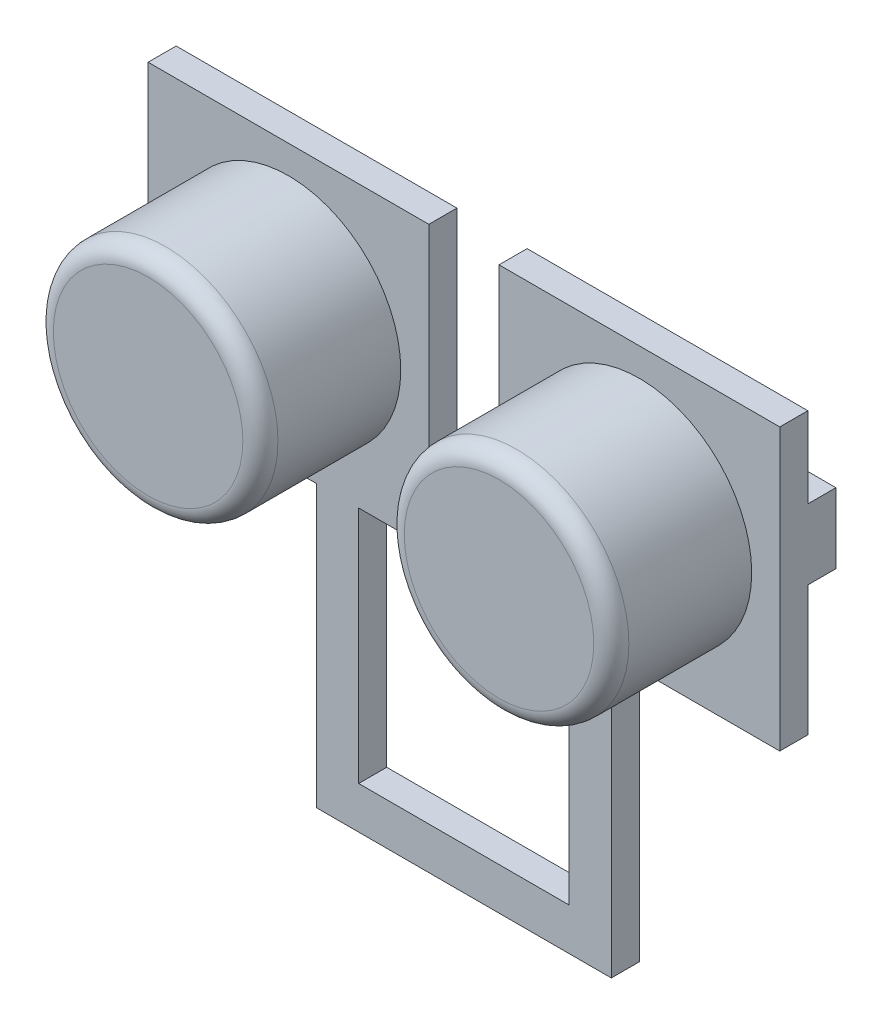
ISO-10303-21;
HEADER;
FILE_DESCRIPTION(('STEP AP214'),'2;1');
FILE_NAME('part.step','',(''),(''),'','','');
FILE_SCHEMA(('AUTOMOTIVE_DESIGN { 1 0 10303 214 1 1 1 1 }'));
ENDSEC;
DATA;
#1=APPLICATION_CONTEXT('core data for automotive mechanical design processes');
#2=APPLICATION_PROTOCOL_DEFINITION('international standard','automotive_design',2000,#1);
#3=PRODUCT_CONTEXT('',#1,'mechanical');
#4=PRODUCT('Part','Part','',(#3));
#5=PRODUCT_RELATED_PRODUCT_CATEGORY('part','',(#4));
#6=PRODUCT_DEFINITION_FORMATION('','',#4);
#7=PRODUCT_DEFINITION_CONTEXT('part definition',#1,'design');
#8=PRODUCT_DEFINITION('design','',#6,#7);
#9=PRODUCT_DEFINITION_SHAPE('','',#8);
#10=(LENGTH_UNIT() NAMED_UNIT(*) SI_UNIT(.MILLI.,.METRE.));
#11=(NAMED_UNIT(*) PLANE_ANGLE_UNIT() SI_UNIT($,.RADIAN.));
#12=(NAMED_UNIT(*) SI_UNIT($,.STERADIAN.) SOLID_ANGLE_UNIT());
#13=UNCERTAINTY_MEASURE_WITH_UNIT(LENGTH_MEASURE(1.E-05),#10,'distance_accuracy_value','');
#14=(GEOMETRIC_REPRESENTATION_CONTEXT(3) GLOBAL_UNCERTAINTY_ASSIGNED_CONTEXT((#13)) GLOBAL_UNIT_ASSIGNED_CONTEXT((#10,
#11,#12)) REPRESENTATION_CONTEXT('',''));
#15=CARTESIAN_POINT('',(0.,0.,0.));
#16=DIRECTION('',(0.,0.,1.));
#17=DIRECTION('',(1.,0.,0.));
#18=AXIS2_PLACEMENT_3D('',#15,#16,#17);
#19=CARTESIAN_POINT('',(-0.999999999999985,-4.00000000000001,-0.8));
#20=DIRECTION('',(0.,1.,0.));
#21=DIRECTION('',(0.,0.,1.));
#22=AXIS2_PLACEMENT_3D('',#19,#20,#21);
#23=PLANE('',#22);
#24=DIRECTION('',(0.,0.,-1.));
#25=VECTOR('',#24,1.);
#26=CARTESIAN_POINT('',(-4.19999999999999,-3.99999999999999,0.));
#27=LINE('',#26,#25);
#28=CARTESIAN_POINT('',(-4.19999999999999,-3.99999999999999,0.));
#29=VERTEX_POINT('',#28);
#30=CARTESIAN_POINT('',(-4.19999999999999,-4.00000000000001,-0.8));
#31=VERTEX_POINT('',#30);
#32=EDGE_CURVE('E309',#29,#31,#27,.T.);
#33=ORIENTED_EDGE('',*,*,#32,.F.);
#34=DIRECTION('',(-1.,0.,0.));
#35=VECTOR('',#34,1.);
#36=CARTESIAN_POINT('',(-0.999999999999985,-4.00000000000001,0.));
#37=LINE('',#36,#35);
#38=CARTESIAN_POINT('',(-9.,-4.00000000000001,0.));
#39=VERTEX_POINT('',#38);
#40=EDGE_CURVE('E365',#29,#39,#37,.T.);
#41=ORIENTED_EDGE('',*,*,#40,.T.);
#42=DIRECTION('',(0.,0.,1.));
#43=VECTOR('',#42,1.);
#44=CARTESIAN_POINT('',(-9.,-4.00000000000001,-0.8));
#45=LINE('',#44,#43);
#46=CARTESIAN_POINT('',(-9.,-4.00000000000001,-0.8));
#47=VERTEX_POINT('',#46);
#48=EDGE_CURVE('E350',#47,#39,#45,.T.);
#49=ORIENTED_EDGE('',*,*,#48,.F.);
#50=DIRECTION('',(-1.,0.,0.));
#51=VECTOR('',#50,1.);
#52=CARTESIAN_POINT('',(-0.999999999999985,-4.00000000000001,-0.8));
#53=LINE('',#52,#51);
#54=EDGE_CURVE('E53',#31,#47,#53,.T.);
#55=ORIENTED_EDGE('',*,*,#54,.F.);
#56=EDGE_LOOP('',(#33,#41,#49,#55));
#57=FACE_BOUND('',#56,.T.);
#58=ADVANCED_FACE('F38',(#57),#23,.F.);
#59=CARTESIAN_POINT('',(-4.99999999999999,0.,4.));
#60=DIRECTION('',(0.,0.,-1.));
#61=DIRECTION('',(-1.,0.,0.));
#62=AXIS2_PLACEMENT_3D('',#59,#60,#61);
#63=CYLINDRICAL_SURFACE('',#62,3.20000000000001);
#64=CARTESIAN_POINT('',(-4.99999999999999,0.,3.5));
#65=DIRECTION('',(0.,0.,1.));
#66=DIRECTION('',(1.,0.,0.));
#67=AXIS2_PLACEMENT_3D('',#64,#65,#66);
#68=CIRCLE('',#67,3.20000000000001);
#69=CARTESIAN_POINT('',(-1.79999999999998,0.,3.5));
#70=VERTEX_POINT('',#69);
#71=EDGE_CURVE('E11',#70,#70,#68,.F.);
#72=ORIENTED_EDGE('',*,*,#71,.T.);
#73=EDGE_LOOP('',(#72));
#74=FACE_BOUND('',#73,.T.);
#75=CARTESIAN_POINT('',(-4.99999999999999,0.,0.));
#76=DIRECTION('',(0.,0.,1.));
#77=DIRECTION('',(1.,0.,0.));
#78=AXIS2_PLACEMENT_3D('',#75,#76,#77);
#79=CIRCLE('',#78,3.20000000000001);
#80=CARTESIAN_POINT('',(-1.79999999999998,0.,0.));
#81=VERTEX_POINT('',#80);
#82=EDGE_CURVE('E371',#81,#81,#79,.T.);
#83=ORIENTED_EDGE('',*,*,#82,.T.);
#84=EDGE_LOOP('',(#83));
#85=FACE_BOUND('',#84,.T.);
#86=ADVANCED_FACE('F401',(#74,#85),#63,.T.);
#87=CARTESIAN_POINT('',(-4.99999999999999,0.,4.));
#88=DIRECTION('',(0.,0.,1.));
#89=DIRECTION('',(1.,0.,0.));
#90=AXIS2_PLACEMENT_3D('',#87,#88,#89);
#91=PLANE('',#90);
#92=CARTESIAN_POINT('',(-4.99999999999999,0.,4.));
#93=DIRECTION('',(0.,0.,1.));
#94=DIRECTION('',(1.,0.,0.));
#95=AXIS2_PLACEMENT_3D('',#92,#93,#94);
#96=CIRCLE('',#95,2.70000000000001);
#97=CARTESIAN_POINT('',(-2.29999999999998,0.,4.));
#98=VERTEX_POINT('',#97);
#99=EDGE_CURVE('E46',#98,#98,#96,.T.);
#100=ORIENTED_EDGE('',*,*,#99,.T.);
#101=EDGE_LOOP('',(#100));
#102=FACE_BOUND('',#101,.T.);
#103=ADVANCED_FACE('F390',(#102),#91,.T.);
#104=CARTESIAN_POINT('',(-0.999999999999984,4.00000000000001,-0.8));
#105=DIRECTION('',(-1.,0.,0.));
#106=DIRECTION('',(0.,-1.,0.));
#107=AXIS2_PLACEMENT_3D('',#104,#105,#106);
#108=PLANE('',#107);
#109=DIRECTION('',(0.,-1.,0.));
#110=VECTOR('',#109,1.);
#111=CARTESIAN_POINT('',(-0.999999999999984,4.00000000000001,0.));
#112=LINE('',#111,#110);
#113=CARTESIAN_POINT('',(-0.999999999999984,4.00000000000001,0.));
#114=VERTEX_POINT('',#113);
#115=CARTESIAN_POINT('',(-0.999999999999985,-4.00000000000001,0.));
#116=VERTEX_POINT('',#115);
#117=EDGE_CURVE('E368',#114,#116,#112,.T.);
#118=ORIENTED_EDGE('',*,*,#117,.T.);
#119=DIRECTION('',(0.,0.,1.));
#120=VECTOR('',#119,1.);
#121=CARTESIAN_POINT('',(-0.999999999999985,-4.00000000000001,-0.8));
#122=LINE('',#121,#120);
#123=CARTESIAN_POINT('',(-0.999999999999985,-4.00000000000001,-0.8));
#124=VERTEX_POINT('',#123);
#125=EDGE_CURVE('E340',#124,#116,#122,.T.);
#126=ORIENTED_EDGE('',*,*,#125,.F.);
#127=DIRECTION('',(0.,-1.,0.));
#128=VECTOR('',#127,1.);
#129=CARTESIAN_POINT('',(-0.999999999999984,4.00000000000001,-0.8));
#130=LINE('',#129,#128);
#131=CARTESIAN_POINT('',(-0.999999999999984,4.00000000000001,-0.8));
#132=VERTEX_POINT('',#131);
#133=EDGE_CURVE('E363',#132,#124,#130,.T.);
#134=ORIENTED_EDGE('',*,*,#133,.F.);
#135=DIRECTION('',(0.,0.,1.));
#136=VECTOR('',#135,1.);
#137=CARTESIAN_POINT('',(-0.999999999999984,4.00000000000001,-0.8));
#138=LINE('',#137,#136);
#139=EDGE_CURVE('E356',#132,#114,#138,.T.);
#140=ORIENTED_EDGE('',*,*,#139,.T.);
#141=EDGE_LOOP('',(#118,#126,#134,#140));
#142=FACE_BOUND('',#141,.T.);
#143=ADVANCED_FACE('F413',(#142),#108,.F.);
#144=CARTESIAN_POINT('',(-2.99999999999998,-4.00000000000001,0.));
#145=VERTEX_POINT('',#144);
#146=EDGE_CURVE('E366',#116,#145,#37,.T.);
#147=ORIENTED_EDGE('',*,*,#146,.T.);
#148=DIRECTION('',(0.,0.,-1.));
#149=VECTOR('',#148,1.);
#150=CARTESIAN_POINT('',(-2.99999999999998,-3.99999999999999,0.));
#151=LINE('',#150,#149);
#152=CARTESIAN_POINT('',(-2.99999999999998,-4.00000000000001,-0.8));
#153=VERTEX_POINT('',#152);
#154=EDGE_CURVE('E61',#145,#153,#151,.T.);
#155=ORIENTED_EDGE('',*,*,#154,.T.);
#156=EDGE_CURVE('E376',#124,#153,#53,.T.);
#157=ORIENTED_EDGE('',*,*,#156,.F.);
#158=ORIENTED_EDGE('',*,*,#125,.T.);
#159=EDGE_LOOP('',(#147,#155,#157,#158));
#160=FACE_BOUND('',#159,.T.);
#161=ADVANCED_FACE('F403',(#160),#23,.F.);
#162=CARTESIAN_POINT('',(-9.,4.00000000000001,-0.8));
#163=DIRECTION('',(1.,0.,0.));
#164=DIRECTION('',(0.,1.,0.));
#165=AXIS2_PLACEMENT_3D('',#162,#163,#164);
#166=PLANE('',#165);
#167=DIRECTION('',(0.,1.,0.));
#168=VECTOR('',#167,1.);
#169=CARTESIAN_POINT('',(-9.,4.00000000000001,0.));
#170=LINE('',#169,#168);
#171=CARTESIAN_POINT('',(-9.,4.00000000000001,0.));
#172=VERTEX_POINT('',#171);
#173=EDGE_CURVE('E362',#39,#172,#170,.T.);
#174=ORIENTED_EDGE('',*,*,#173,.T.);
#175=DIRECTION('',(0.,0.,1.));
#176=VECTOR('',#175,1.);
#177=CARTESIAN_POINT('',(-9.,4.00000000000001,-0.8));
#178=LINE('',#177,#176);
#179=CARTESIAN_POINT('',(-9.,4.00000000000001,-0.8));
#180=VERTEX_POINT('',#179);
#181=EDGE_CURVE('E353',#180,#172,#178,.T.);
#182=ORIENTED_EDGE('',*,*,#181,.F.);
#183=DIRECTION('',(0.,1.,0.));
#184=VECTOR('',#183,1.);
#185=CARTESIAN_POINT('',(-9.,4.00000000000001,-0.8));
#186=LINE('',#185,#184);
#187=CARTESIAN_POINT('',(-9.,1.7,-0.8));
#188=VERTEX_POINT('',#187);
#189=EDGE_CURVE('E373',#188,#180,#186,.T.);
#190=ORIENTED_EDGE('',*,*,#189,.F.);
#191=DIRECTION('',(0.,0.,1.));
#192=VECTOR('',#191,1.);
#193=CARTESIAN_POINT('',(-9.,1.7,-1.6));
#194=LINE('',#193,#192);
#195=CARTESIAN_POINT('',(-9.,1.7,-1.6));
#196=VERTEX_POINT('',#195);
#197=EDGE_CURVE('E303',#196,#188,#194,.T.);
#198=ORIENTED_EDGE('',*,*,#197,.F.);
#199=DIRECTION('',(0.,1.,0.));
#200=VECTOR('',#199,1.);
#201=CARTESIAN_POINT('',(-9.,1.7,-1.6));
#202=LINE('',#201,#200);
#203=CARTESIAN_POINT('',(-9.,-0.300000000000003,-1.6));
#204=VERTEX_POINT('',#203);
#205=EDGE_CURVE('E334',#204,#196,#202,.T.);
#206=ORIENTED_EDGE('',*,*,#205,.F.);
#207=DIRECTION('',(0.,0.,1.));
#208=VECTOR('',#207,1.);
#209=CARTESIAN_POINT('',(-9.,-0.300000000000003,-1.6));
#210=LINE('',#209,#208);
#211=CARTESIAN_POINT('',(-9.,-0.300000000000004,-0.8));
#212=VERTEX_POINT('',#211);
#213=EDGE_CURVE('E326',#204,#212,#210,.T.);
#214=ORIENTED_EDGE('',*,*,#213,.T.);
#215=EDGE_CURVE('E374',#47,#212,#186,.T.);
#216=ORIENTED_EDGE('',*,*,#215,.F.);
#217=ORIENTED_EDGE('',*,*,#48,.T.);
#218=EDGE_LOOP('',(#174,#182,#190,#198,#206,#214,#216,#217));
#219=FACE_BOUND('',#218,.T.);
#220=ADVANCED_FACE('F412',(#219),#166,.F.);
#221=CARTESIAN_POINT('',(-0.999999999999984,4.00000000000001,-0.8));
#222=DIRECTION('',(0.,-1.,0.));
#223=DIRECTION('',(0.,0.,-1.));
#224=AXIS2_PLACEMENT_3D('',#221,#222,#223);
#225=PLANE('',#224);
#226=DIRECTION('',(1.,0.,0.));
#227=VECTOR('',#226,1.);
#228=CARTESIAN_POINT('',(-0.999999999999984,4.00000000000001,0.));
#229=LINE('',#228,#227);
#230=EDGE_CURVE('E360',#172,#114,#229,.T.);
#231=ORIENTED_EDGE('',*,*,#230,.T.);
#232=ORIENTED_EDGE('',*,*,#139,.F.);
#233=DIRECTION('',(1.,0.,0.));
#234=VECTOR('',#233,1.);
#235=CARTESIAN_POINT('',(-0.999999999999984,4.00000000000001,-0.8));
#236=LINE('',#235,#234);
#237=EDGE_CURVE('E359',#180,#132,#236,.T.);
#238=ORIENTED_EDGE('',*,*,#237,.F.);
#239=ORIENTED_EDGE('',*,*,#181,.T.);
#240=EDGE_LOOP('',(#231,#232,#238,#239));
#241=FACE_BOUND('',#240,.T.);
#242=ADVANCED_FACE('F418',(#241),#225,.F.);
#243=CARTESIAN_POINT('',(0.,0.,-0.8));
#244=DIRECTION('',(0.,0.,-1.));
#245=DIRECTION('',(-1.,0.,0.));
#246=AXIS2_PLACEMENT_3D('',#243,#244,#245);
#247=PLANE('',#246);
#248=DIRECTION('',(-1.,0.,0.));
#249=VECTOR('',#248,1.);
#250=CARTESIAN_POINT('',(-9.,-0.300000000000003,-0.8));
#251=LINE('',#250,#249);
#252=CARTESIAN_POINT('',(-6.99999999999999,-0.300000000000005,-0.8));
#253=VERTEX_POINT('',#252);
#254=EDGE_CURVE('E330',#253,#212,#251,.T.);
#255=ORIENTED_EDGE('',*,*,#254,.F.);
#256=DIRECTION('',(0.,-1.,0.));
#257=VECTOR('',#256,1.);
#258=CARTESIAN_POINT('',(-6.99999999999999,1.7,-0.8));
#259=LINE('',#258,#257);
#260=CARTESIAN_POINT('',(-6.99999999999999,1.7,-0.8));
#261=VERTEX_POINT('',#260);
#262=EDGE_CURVE('E333',#261,#253,#259,.T.);
#263=ORIENTED_EDGE('',*,*,#262,.F.);
#264=DIRECTION('',(1.,0.,0.));
#265=VECTOR('',#264,1.);
#266=CARTESIAN_POINT('',(-9.,1.7,-0.8));
#267=LINE('',#266,#265);
#268=EDGE_CURVE('E337',#188,#261,#267,.T.);
#269=ORIENTED_EDGE('',*,*,#268,.F.);
#270=ORIENTED_EDGE('',*,*,#189,.T.);
#271=ORIENTED_EDGE('',*,*,#237,.T.);
#272=ORIENTED_EDGE('',*,*,#133,.T.);
#273=ORIENTED_EDGE('',*,*,#156,.T.);
#274=DIRECTION('',(0.,-1.,0.));
#275=VECTOR('',#274,1.);
#276=CARTESIAN_POINT('',(-2.99999999999998,0.,-0.8));
#277=LINE('',#276,#275);
#278=CARTESIAN_POINT('',(-2.99999999999998,-10.8,-0.8));
#279=VERTEX_POINT('',#278);
#280=EDGE_CURVE('E292',#153,#279,#277,.T.);
#281=ORIENTED_EDGE('',*,*,#280,.T.);
#282=DIRECTION('',(1.,0.,0.));
#283=VECTOR('',#282,1.);
#284=CARTESIAN_POINT('',(0.,-10.8,-0.8));
#285=LINE('',#284,#283);
#286=CARTESIAN_POINT('',(3.00000000000001,-10.8,-0.8));
#287=VERTEX_POINT('',#286);
#288=EDGE_CURVE('E295',#279,#287,#285,.T.);
#289=ORIENTED_EDGE('',*,*,#288,.T.);
#290=DIRECTION('',(0.,-1.,0.));
#291=VECTOR('',#290,1.);
#292=CARTESIAN_POINT('',(3.00000000000001,0.,-0.8));
#293=LINE('',#292,#291);
#294=CARTESIAN_POINT('',(3.00000000000001,-3.99999999999999,-0.8));
#295=VERTEX_POINT('',#294);
#296=EDGE_CURVE('E272',#295,#287,#293,.T.);
#297=ORIENTED_EDGE('',*,*,#296,.F.);
#298=DIRECTION('',(-1.,0.,0.));
#299=VECTOR('',#298,1.);
#300=CARTESIAN_POINT('',(9.,-3.99999999999999,-0.8));
#301=LINE('',#300,#299);
#302=CARTESIAN_POINT('',(1.00000000000001,-3.99999999999999,-0.8));
#303=VERTEX_POINT('',#302);
#304=EDGE_CURVE('E237',#295,#303,#301,.T.);
#305=ORIENTED_EDGE('',*,*,#304,.T.);
#306=DIRECTION('',(0.,1.,0.));
#307=VECTOR('',#306,1.);
#308=CARTESIAN_POINT('',(1.00000000000001,3.99999999999999,-0.8));
#309=LINE('',#308,#307);
#310=CARTESIAN_POINT('',(1.00000000000001,3.99999999999999,-0.8));
#311=VERTEX_POINT('',#310);
#312=EDGE_CURVE('E241',#303,#311,#309,.T.);
#313=ORIENTED_EDGE('',*,*,#312,.T.);
#314=DIRECTION('',(1.,0.,0.));
#315=VECTOR('',#314,1.);
#316=CARTESIAN_POINT('',(9.,3.99999999999999,-0.8));
#317=LINE('',#316,#315);
#318=CARTESIAN_POINT('',(9.,3.99999999999999,-0.8));
#319=VERTEX_POINT('',#318);
#320=EDGE_CURVE('E243',#311,#319,#317,.T.);
#321=ORIENTED_EDGE('',*,*,#320,.T.);
#322=DIRECTION('',(0.,-1.,0.));
#323=VECTOR('',#322,1.);
#324=CARTESIAN_POINT('',(9.,3.99999999999999,-0.8));
#325=LINE('',#324,#323);
#326=CARTESIAN_POINT('',(9.,1.7,-0.8));
#327=VERTEX_POINT('',#326);
#328=EDGE_CURVE('E235',#319,#327,#325,.T.);
#329=ORIENTED_EDGE('',*,*,#328,.T.);
#330=DIRECTION('',(1.,0.,0.));
#331=VECTOR('',#330,1.);
#332=CARTESIAN_POINT('',(9.,1.7,-0.8));
#333=LINE('',#332,#331);
#334=CARTESIAN_POINT('',(7.00000000000001,1.7,-0.8));
#335=VERTEX_POINT('',#334);
#336=EDGE_CURVE('E220',#335,#327,#333,.T.);
#337=ORIENTED_EDGE('',*,*,#336,.F.);
#338=DIRECTION('',(0.,1.,0.));
#339=VECTOR('',#338,1.);
#340=CARTESIAN_POINT('',(7.00000000000001,1.7,-0.8));
#341=LINE('',#340,#339);
#342=CARTESIAN_POINT('',(7.00000000000001,-0.300000000000004,-0.8));
#343=VERTEX_POINT('',#342);
#344=EDGE_CURVE('E490',#343,#335,#341,.T.);
#345=ORIENTED_EDGE('',*,*,#344,.F.);
#346=DIRECTION('',(-1.,0.,0.));
#347=VECTOR('',#346,1.);
#348=CARTESIAN_POINT('',(9.,-0.300000000000004,-0.8));
#349=LINE('',#348,#347);
#350=CARTESIAN_POINT('',(9.,-0.300000000000004,-0.8));
#351=VERTEX_POINT('',#350);
#352=EDGE_CURVE('E496',#351,#343,#349,.T.);
#353=ORIENTED_EDGE('',*,*,#352,.F.);
#354=CARTESIAN_POINT('',(9.,-3.99999999999999,-0.8));
#355=VERTEX_POINT('',#354);
#356=EDGE_CURVE('E226',#351,#355,#325,.T.);
#357=ORIENTED_EDGE('',*,*,#356,.T.);
#358=CARTESIAN_POINT('',(4.20000000000001,-3.99999999999999,-0.8));
#359=VERTEX_POINT('',#358);
#360=EDGE_CURVE('E238',#355,#359,#301,.T.);
#361=ORIENTED_EDGE('',*,*,#360,.T.);
#362=DIRECTION('',(0.,-1.,0.));
#363=VECTOR('',#362,1.);
#364=CARTESIAN_POINT('',(4.20000000000001,0.,-0.8));
#365=LINE('',#364,#363);
#366=CARTESIAN_POINT('',(4.20000000000001,-12.,-0.8));
#367=VERTEX_POINT('',#366);
#368=EDGE_CURVE('E267',#359,#367,#365,.T.);
#369=ORIENTED_EDGE('',*,*,#368,.T.);
#370=DIRECTION('',(1.,0.,0.));
#371=VECTOR('',#370,1.);
#372=CARTESIAN_POINT('',(0.,-12.,-0.8));
#373=LINE('',#372,#371);
#374=CARTESIAN_POINT('',(-4.19999999999999,-12.,-0.8));
#375=VERTEX_POINT('',#374);
#376=EDGE_CURVE('E287',#375,#367,#373,.T.);
#377=ORIENTED_EDGE('',*,*,#376,.F.);
#378=DIRECTION('',(0.,-1.,0.));
#379=VECTOR('',#378,1.);
#380=CARTESIAN_POINT('',(-4.19999999999999,0.,-0.8));
#381=LINE('',#380,#379);
#382=EDGE_CURVE('E290',#31,#375,#381,.T.);
#383=ORIENTED_EDGE('',*,*,#382,.F.);
#384=ORIENTED_EDGE('',*,*,#54,.T.);
#385=ORIENTED_EDGE('',*,*,#215,.T.);
#386=EDGE_LOOP('',(#255,#263,#269,#270,#271,#272,#273,#281,#289,#297,#305,#313,#321,#329,#337,
#345,#353,#357,#361,#369,#377,#383,#384,#385));
#387=FACE_BOUND('',#386,.T.);
#388=ADVANCED_FACE('F437',(#387),#247,.T.);
#389=CARTESIAN_POINT('',(0.,0.,0.));
#390=DIRECTION('',(0.,0.,-1.));
#391=DIRECTION('',(-1.,0.,0.));
#392=AXIS2_PLACEMENT_3D('',#389,#390,#391);
#393=PLANE('',#392);
#394=ORIENTED_EDGE('',*,*,#82,.F.);
#395=EDGE_LOOP('',(#394));
#396=FACE_BOUND('',#395,.T.);
#397=ORIENTED_EDGE('',*,*,#117,.F.);
#398=ORIENTED_EDGE('',*,*,#230,.F.);
#399=ORIENTED_EDGE('',*,*,#173,.F.);
#400=ORIENTED_EDGE('',*,*,#40,.F.);
#401=DIRECTION('',(0.,-1.,0.));
#402=VECTOR('',#401,1.);
#403=CARTESIAN_POINT('',(-4.19999999999999,0.,0.));
#404=LINE('',#403,#402);
#405=CARTESIAN_POINT('',(-4.19999999999999,-12.,0.));
#406=VERTEX_POINT('',#405);
#407=EDGE_CURVE('E274',#29,#406,#404,.T.);
#408=ORIENTED_EDGE('',*,*,#407,.T.);
#409=DIRECTION('',(1.,0.,0.));
#410=VECTOR('',#409,1.);
#411=CARTESIAN_POINT('',(0.,-12.,0.));
#412=LINE('',#411,#410);
#413=CARTESIAN_POINT('',(4.20000000000001,-12.,0.));
#414=VERTEX_POINT('',#413);
#415=EDGE_CURVE('E271',#406,#414,#412,.T.);
#416=ORIENTED_EDGE('',*,*,#415,.T.);
#417=DIRECTION('',(0.,-1.,0.));
#418=VECTOR('',#417,1.);
#419=CARTESIAN_POINT('',(4.20000000000001,0.,0.));
#420=LINE('',#419,#418);
#421=CARTESIAN_POINT('',(4.20000000000001,-3.99999999999999,0.));
#422=VERTEX_POINT('',#421);
#423=EDGE_CURVE('E268',#422,#414,#420,.T.);
#424=ORIENTED_EDGE('',*,*,#423,.F.);
#425=DIRECTION('',(-1.,0.,0.));
#426=VECTOR('',#425,1.);
#427=CARTESIAN_POINT('',(9.,-3.99999999999999,0.));
#428=LINE('',#427,#426);
#429=CARTESIAN_POINT('',(9.,-3.99999999999999,0.));
#430=VERTEX_POINT('',#429);
#431=EDGE_CURVE('E246',#430,#422,#428,.T.);
#432=ORIENTED_EDGE('',*,*,#431,.F.);
#433=DIRECTION('',(0.,-1.,0.));
#434=VECTOR('',#433,1.);
#435=CARTESIAN_POINT('',(9.,3.99999999999999,0.));
#436=LINE('',#435,#434);
#437=CARTESIAN_POINT('',(9.,3.99999999999999,0.));
#438=VERTEX_POINT('',#437);
#439=EDGE_CURVE('E227',#438,#430,#436,.T.);
#440=ORIENTED_EDGE('',*,*,#439,.F.);
#441=DIRECTION('',(1.,0.,0.));
#442=VECTOR('',#441,1.);
#443=CARTESIAN_POINT('',(9.,3.99999999999999,0.));
#444=LINE('',#443,#442);
#445=CARTESIAN_POINT('',(1.00000000000001,3.99999999999999,0.));
#446=VERTEX_POINT('',#445);
#447=EDGE_CURVE('E251',#446,#438,#444,.T.);
#448=ORIENTED_EDGE('',*,*,#447,.F.);
#449=DIRECTION('',(0.,1.,0.));
#450=VECTOR('',#449,1.);
#451=CARTESIAN_POINT('',(1.00000000000001,3.99999999999999,0.));
#452=LINE('',#451,#450);
#453=CARTESIAN_POINT('',(1.00000000000001,-3.99999999999999,0.));
#454=VERTEX_POINT('',#453);
#455=EDGE_CURVE('E249',#454,#446,#452,.T.);
#456=ORIENTED_EDGE('',*,*,#455,.F.);
#457=CARTESIAN_POINT('',(3.00000000000001,-3.99999999999999,0.));
#458=VERTEX_POINT('',#457);
#459=EDGE_CURVE('E229',#458,#454,#428,.T.);
#460=ORIENTED_EDGE('',*,*,#459,.F.);
#461=DIRECTION('',(0.,-1.,0.));
#462=VECTOR('',#461,1.);
#463=CARTESIAN_POINT('',(3.00000000000001,0.,0.));
#464=LINE('',#463,#462);
#465=CARTESIAN_POINT('',(3.00000000000001,-10.8,0.));
#466=VERTEX_POINT('',#465);
#467=EDGE_CURVE('E282',#458,#466,#464,.T.);
#468=ORIENTED_EDGE('',*,*,#467,.T.);
#469=DIRECTION('',(1.,0.,0.));
#470=VECTOR('',#469,1.);
#471=CARTESIAN_POINT('',(0.,-10.8,0.));
#472=LINE('',#471,#470);
#473=CARTESIAN_POINT('',(-2.99999999999998,-10.8,0.));
#474=VERTEX_POINT('',#473);
#475=EDGE_CURVE('E279',#474,#466,#472,.T.);
#476=ORIENTED_EDGE('',*,*,#475,.F.);
#477=DIRECTION('',(0.,-1.,0.));
#478=VECTOR('',#477,1.);
#479=CARTESIAN_POINT('',(-2.99999999999998,0.,0.));
#480=LINE('',#479,#478);
#481=EDGE_CURVE('E276',#145,#474,#480,.T.);
#482=ORIENTED_EDGE('',*,*,#481,.F.);
#483=ORIENTED_EDGE('',*,*,#146,.F.);
#484=EDGE_LOOP('',(#397,#398,#399,#400,#408,#416,#424,#432,#440,#448,#456,#460,#468,#476,#482,#483));
#485=FACE_BOUND('',#484,.T.);
#486=CARTESIAN_POINT('',(5.,0.,0.));
#487=DIRECTION('',(0.,0.,1.));
#488=DIRECTION('',(1.,0.,0.));
#489=AXIS2_PLACEMENT_3D('',#486,#487,#488);
#490=CIRCLE('',#489,3.19999999999999);
#491=CARTESIAN_POINT('',(8.2,0.,0.));
#492=VERTEX_POINT('',#491);
#493=EDGE_CURVE('E264',#492,#492,#490,.T.);
#494=ORIENTED_EDGE('',*,*,#493,.F.);
#495=EDGE_LOOP('',(#494));
#496=FACE_BOUND('',#495,.T.);
#497=ADVANCED_FACE('F429',(#396,#485,#496),#393,.F.);
#498=CARTESIAN_POINT('',(-9.,1.7,-1.6));
#499=DIRECTION('',(0.,-1.,0.));
#500=DIRECTION('',(1.,0.,0.));
#501=AXIS2_PLACEMENT_3D('',#498,#499,#500);
#502=PLANE('',#501);
#503=ORIENTED_EDGE('',*,*,#268,.T.);
#504=DIRECTION('',(0.,0.,1.));
#505=VECTOR('',#504,1.);
#506=CARTESIAN_POINT('',(-6.99999999999999,1.7,-1.6));
#507=LINE('',#506,#505);
#508=CARTESIAN_POINT('',(-6.99999999999999,1.7,-1.6));
#509=VERTEX_POINT('',#508);
#510=EDGE_CURVE('E320',#509,#261,#507,.T.);
#511=ORIENTED_EDGE('',*,*,#510,.F.);
#512=DIRECTION('',(1.,0.,0.));
#513=VECTOR('',#512,1.);
#514=CARTESIAN_POINT('',(-9.,1.7,-1.6));
#515=LINE('',#514,#513);
#516=EDGE_CURVE('E344',#196,#509,#515,.T.);
#517=ORIENTED_EDGE('',*,*,#516,.F.);
#518=ORIENTED_EDGE('',*,*,#197,.T.);
#519=EDGE_LOOP('',(#503,#511,#517,#518));
#520=FACE_BOUND('',#519,.T.);
#521=ADVANCED_FACE('F513',(#520),#502,.F.);
#522=CARTESIAN_POINT('',(-6.99999999999999,1.7,-1.6));
#523=DIRECTION('',(-1.,0.,0.));
#524=DIRECTION('',(0.,-1.,0.));
#525=AXIS2_PLACEMENT_3D('',#522,#523,#524);
#526=PLANE('',#525);
#527=ORIENTED_EDGE('',*,*,#262,.T.);
#528=DIRECTION('',(0.,0.,1.));
#529=VECTOR('',#528,1.);
#530=CARTESIAN_POINT('',(-6.99999999999999,-0.300000000000005,-1.6));
#531=LINE('',#530,#529);
#532=CARTESIAN_POINT('',(-6.99999999999999,-0.300000000000005,-1.6));
#533=VERTEX_POINT('',#532);
#534=EDGE_CURVE('E323',#533,#253,#531,.T.);
#535=ORIENTED_EDGE('',*,*,#534,.F.);
#536=DIRECTION('',(0.,-1.,0.));
#537=VECTOR('',#536,1.);
#538=CARTESIAN_POINT('',(-6.99999999999999,1.7,-1.6));
#539=LINE('',#538,#537);
#540=EDGE_CURVE('E342',#509,#533,#539,.T.);
#541=ORIENTED_EDGE('',*,*,#540,.F.);
#542=ORIENTED_EDGE('',*,*,#510,.T.);
#543=EDGE_LOOP('',(#527,#535,#541,#542));
#544=FACE_BOUND('',#543,.T.);
#545=ADVANCED_FACE('F511',(#544),#526,.F.);
#546=CARTESIAN_POINT('',(-9.,-0.300000000000003,-1.6));
#547=DIRECTION('',(0.,1.,0.));
#548=DIRECTION('',(-1.,0.,0.));
#549=AXIS2_PLACEMENT_3D('',#546,#547,#548);
#550=PLANE('',#549);
#551=ORIENTED_EDGE('',*,*,#254,.T.);
#552=ORIENTED_EDGE('',*,*,#213,.F.);
#553=DIRECTION('',(-1.,0.,0.));
#554=VECTOR('',#553,1.);
#555=CARTESIAN_POINT('',(-9.,-0.300000000000003,-1.6));
#556=LINE('',#555,#554);
#557=EDGE_CURVE('E329',#533,#204,#556,.T.);
#558=ORIENTED_EDGE('',*,*,#557,.F.);
#559=ORIENTED_EDGE('',*,*,#534,.T.);
#560=EDGE_LOOP('',(#551,#552,#558,#559));
#561=FACE_BOUND('',#560,.T.);
#562=ADVANCED_FACE('F502',(#561),#550,.F.);
#563=CARTESIAN_POINT('',(0.,0.,-1.6));
#564=DIRECTION('',(0.,0.,1.));
#565=DIRECTION('',(1.,0.,0.));
#566=AXIS2_PLACEMENT_3D('',#563,#564,#565);
#567=PLANE('',#566);
#568=ORIENTED_EDGE('',*,*,#205,.T.);
#569=ORIENTED_EDGE('',*,*,#516,.T.);
#570=ORIENTED_EDGE('',*,*,#540,.T.);
#571=ORIENTED_EDGE('',*,*,#557,.T.);
#572=EDGE_LOOP('',(#568,#569,#570,#571));
#573=FACE_BOUND('',#572,.T.);
#574=ADVANCED_FACE('F507',(#573),#567,.F.);
#575=CARTESIAN_POINT('',(3.00000000000001,0.,0.));
#576=DIRECTION('',(1.,0.,0.));
#577=DIRECTION('',(0.,1.,0.));
#578=AXIS2_PLACEMENT_3D('',#575,#576,#577);
#579=PLANE('',#578);
#580=ORIENTED_EDGE('',*,*,#296,.T.);
#581=DIRECTION('',(0.,0.,-1.));
#582=VECTOR('',#581,1.);
#583=CARTESIAN_POINT('',(3.00000000000001,-10.8,0.));
#584=LINE('',#583,#582);
#585=EDGE_CURVE('E304',#466,#287,#584,.T.);
#586=ORIENTED_EDGE('',*,*,#585,.F.);
#587=ORIENTED_EDGE('',*,*,#467,.F.);
#588=DIRECTION('',(0.,0.,-1.));
#589=VECTOR('',#588,1.);
#590=CARTESIAN_POINT('',(3.00000000000001,-3.99999999999999,0.));
#591=LINE('',#590,#589);
#592=EDGE_CURVE('E300',#458,#295,#591,.T.);
#593=ORIENTED_EDGE('',*,*,#592,.T.);
#594=EDGE_LOOP('',(#580,#586,#587,#593));
#595=FACE_BOUND('',#594,.T.);
#596=ADVANCED_FACE('F482',(#595),#579,.F.);
#597=CARTESIAN_POINT('',(0.,-10.8,0.));
#598=DIRECTION('',(0.,1.,0.));
#599=DIRECTION('',(0.,0.,1.));
#600=AXIS2_PLACEMENT_3D('',#597,#598,#599);
#601=PLANE('',#600);
#602=ORIENTED_EDGE('',*,*,#288,.F.);
#603=DIRECTION('',(0.,0.,-1.));
#604=VECTOR('',#603,1.);
#605=CARTESIAN_POINT('',(-2.99999999999998,-10.8,0.));
#606=LINE('',#605,#604);
#607=EDGE_CURVE('E306',#474,#279,#606,.T.);
#608=ORIENTED_EDGE('',*,*,#607,.F.);
#609=ORIENTED_EDGE('',*,*,#475,.T.);
#610=ORIENTED_EDGE('',*,*,#585,.T.);
#611=EDGE_LOOP('',(#602,#608,#609,#610));
#612=FACE_BOUND('',#611,.T.);
#613=ADVANCED_FACE('F435',(#612),#601,.T.);
#614=CARTESIAN_POINT('',(-2.99999999999998,0.,0.));
#615=DIRECTION('',(1.,0.,0.));
#616=DIRECTION('',(0.,1.,0.));
#617=AXIS2_PLACEMENT_3D('',#614,#615,#616);
#618=PLANE('',#617);
#619=ORIENTED_EDGE('',*,*,#280,.F.);
#620=ORIENTED_EDGE('',*,*,#154,.F.);
#621=ORIENTED_EDGE('',*,*,#481,.T.);
#622=ORIENTED_EDGE('',*,*,#607,.T.);
#623=EDGE_LOOP('',(#619,#620,#621,#622));
#624=FACE_BOUND('',#623,.T.);
#625=ADVANCED_FACE('F427',(#624),#618,.T.);
#626=CARTESIAN_POINT('',(-4.19999999999999,0.,0.));
#627=DIRECTION('',(1.,0.,0.));
#628=DIRECTION('',(0.,0.,-1.));
#629=AXIS2_PLACEMENT_3D('',#626,#627,#628);
#630=PLANE('',#629);
#631=ORIENTED_EDGE('',*,*,#382,.T.);
#632=DIRECTION('',(0.,0.,-1.));
#633=VECTOR('',#632,1.);
#634=CARTESIAN_POINT('',(-4.19999999999999,-12.,0.));
#635=LINE('',#634,#633);
#636=EDGE_CURVE('E311',#406,#375,#635,.T.);
#637=ORIENTED_EDGE('',*,*,#636,.F.);
#638=ORIENTED_EDGE('',*,*,#407,.F.);
#639=ORIENTED_EDGE('',*,*,#32,.T.);
#640=EDGE_LOOP('',(#631,#637,#638,#639));
#641=FACE_BOUND('',#640,.T.);
#642=ADVANCED_FACE('F454',(#641),#630,.F.);
#643=CARTESIAN_POINT('',(0.,-12.,0.));
#644=DIRECTION('',(0.,1.,0.));
#645=DIRECTION('',(-1.,0.,0.));
#646=AXIS2_PLACEMENT_3D('',#643,#644,#645);
#647=PLANE('',#646);
#648=ORIENTED_EDGE('',*,*,#376,.T.);
#649=DIRECTION('',(0.,0.,-1.));
#650=VECTOR('',#649,1.);
#651=CARTESIAN_POINT('',(4.20000000000001,-12.,0.));
#652=LINE('',#651,#650);
#653=EDGE_CURVE('E314',#414,#367,#652,.T.);
#654=ORIENTED_EDGE('',*,*,#653,.F.);
#655=ORIENTED_EDGE('',*,*,#415,.F.);
#656=ORIENTED_EDGE('',*,*,#636,.T.);
#657=EDGE_LOOP('',(#648,#654,#655,#656));
#658=FACE_BOUND('',#657,.T.);
#659=ADVANCED_FACE('F458',(#658),#647,.F.);
#660=CARTESIAN_POINT('',(4.20000000000001,0.,0.));
#661=DIRECTION('',(1.,0.,0.));
#662=DIRECTION('',(0.,1.,0.));
#663=AXIS2_PLACEMENT_3D('',#660,#661,#662);
#664=PLANE('',#663);
#665=ORIENTED_EDGE('',*,*,#368,.F.);
#666=DIRECTION('',(0.,0.,-1.));
#667=VECTOR('',#666,1.);
#668=CARTESIAN_POINT('',(4.20000000000001,-3.99999999999999,0.));
#669=LINE('',#668,#667);
#670=EDGE_CURVE('E284',#422,#359,#669,.T.);
#671=ORIENTED_EDGE('',*,*,#670,.F.);
#672=ORIENTED_EDGE('',*,*,#423,.T.);
#673=ORIENTED_EDGE('',*,*,#653,.T.);
#674=EDGE_LOOP('',(#665,#671,#672,#673));
#675=FACE_BOUND('',#674,.T.);
#676=ADVANCED_FACE('F460',(#675),#664,.T.);
#677=CARTESIAN_POINT('',(9.,-3.99999999999999,-0.8));
#678=DIRECTION('',(0.,1.,0.));
#679=DIRECTION('',(0.,0.,1.));
#680=AXIS2_PLACEMENT_3D('',#677,#678,#679);
#681=PLANE('',#680);
#682=ORIENTED_EDGE('',*,*,#304,.F.);
#683=ORIENTED_EDGE('',*,*,#592,.F.);
#684=ORIENTED_EDGE('',*,*,#459,.T.);
#685=DIRECTION('',(0.,0.,1.));
#686=VECTOR('',#685,1.);
#687=CARTESIAN_POINT('',(1.00000000000001,-3.99999999999999,-0.8));
#688=LINE('',#687,#686);
#689=EDGE_CURVE('E258',#303,#454,#688,.T.);
#690=ORIENTED_EDGE('',*,*,#689,.F.);
#691=EDGE_LOOP('',(#682,#683,#684,#690));
#692=FACE_BOUND('',#691,.T.);
#693=ADVANCED_FACE('F479',(#692),#681,.F.);
#694=CARTESIAN_POINT('',(5.,0.,4.));
#695=DIRECTION('',(0.,0.,-1.));
#696=DIRECTION('',(-1.,0.,0.));
#697=AXIS2_PLACEMENT_3D('',#694,#695,#696);
#698=CYLINDRICAL_SURFACE('',#697,3.19999999999999);
#699=CARTESIAN_POINT('',(5.,0.,3.5));
#700=DIRECTION('',(0.,0.,1.));
#701=DIRECTION('',(1.,0.,0.));
#702=AXIS2_PLACEMENT_3D('',#699,#700,#701);
#703=CIRCLE('',#702,3.19999999999999);
#704=CARTESIAN_POINT('',(8.2,0.,3.5));
#705=VERTEX_POINT('',#704);
#706=EDGE_CURVE('E385',#705,#705,#703,.F.);
#707=ORIENTED_EDGE('',*,*,#706,.T.);
#708=EDGE_LOOP('',(#707));
#709=FACE_BOUND('',#708,.T.);
#710=ORIENTED_EDGE('',*,*,#493,.T.);
#711=EDGE_LOOP('',(#710));
#712=FACE_BOUND('',#711,.T.);
#713=ADVANCED_FACE('F551',(#709,#712),#698,.T.);
#714=CARTESIAN_POINT('',(5.,0.,4.));
#715=DIRECTION('',(0.,0.,1.));
#716=DIRECTION('',(1.,0.,0.));
#717=AXIS2_PLACEMENT_3D('',#714,#715,#716);
#718=PLANE('',#717);
#719=CARTESIAN_POINT('',(5.,0.,4.));
#720=DIRECTION('',(0.,0.,1.));
#721=DIRECTION('',(1.,0.,0.));
#722=AXIS2_PLACEMENT_3D('',#719,#720,#721);
#723=CIRCLE('',#722,2.69999999999999);
#724=CARTESIAN_POINT('',(7.7,0.,4.));
#725=VERTEX_POINT('',#724);
#726=EDGE_CURVE('E382',#725,#725,#723,.T.);
#727=ORIENTED_EDGE('',*,*,#726,.T.);
#728=EDGE_LOOP('',(#727));
#729=FACE_BOUND('',#728,.T.);
#730=ADVANCED_FACE('F538',(#729),#718,.T.);
#731=CARTESIAN_POINT('',(9.,3.99999999999999,-0.8));
#732=DIRECTION('',(-1.,0.,0.));
#733=DIRECTION('',(0.,-1.,0.));
#734=AXIS2_PLACEMENT_3D('',#731,#732,#733);
#735=PLANE('',#734);
#736=ORIENTED_EDGE('',*,*,#439,.T.);
#737=DIRECTION('',(0.,0.,1.));
#738=VECTOR('',#737,1.);
#739=CARTESIAN_POINT('',(9.,-3.99999999999999,-0.8));
#740=LINE('',#739,#738);
#741=EDGE_CURVE('E261',#355,#430,#740,.T.);
#742=ORIENTED_EDGE('',*,*,#741,.F.);
#743=ORIENTED_EDGE('',*,*,#356,.F.);
#744=DIRECTION('',(0.,0.,1.));
#745=VECTOR('',#744,1.);
#746=CARTESIAN_POINT('',(9.,-0.300000000000004,-1.6));
#747=LINE('',#746,#745);
#748=CARTESIAN_POINT('',(9.,-0.300000000000004,-1.6));
#749=VERTEX_POINT('',#748);
#750=EDGE_CURVE('E205',#749,#351,#747,.T.);
#751=ORIENTED_EDGE('',*,*,#750,.F.);
#752=DIRECTION('',(0.,-1.,0.));
#753=VECTOR('',#752,1.);
#754=CARTESIAN_POINT('',(9.,1.7,-1.6));
#755=LINE('',#754,#753);
#756=CARTESIAN_POINT('',(9.,1.7,-1.6));
#757=VERTEX_POINT('',#756);
#758=EDGE_CURVE('E211',#757,#749,#755,.T.);
#759=ORIENTED_EDGE('',*,*,#758,.F.);
#760=DIRECTION('',(0.,0.,1.));
#761=VECTOR('',#760,1.);
#762=CARTESIAN_POINT('',(9.,1.7,-1.6));
#763=LINE('',#762,#761);
#764=EDGE_CURVE('E488',#757,#327,#763,.T.);
#765=ORIENTED_EDGE('',*,*,#764,.T.);
#766=ORIENTED_EDGE('',*,*,#328,.F.);
#767=DIRECTION('',(0.,0.,1.));
#768=VECTOR('',#767,1.);
#769=CARTESIAN_POINT('',(9.,3.99999999999999,-0.8));
#770=LINE('',#769,#768);
#771=EDGE_CURVE('E244',#319,#438,#770,.T.);
#772=ORIENTED_EDGE('',*,*,#771,.T.);
#773=EDGE_LOOP('',(#736,#742,#743,#751,#759,#765,#766,#772));
#774=FACE_BOUND('',#773,.T.);
#775=ADVANCED_FACE('F224',(#774),#735,.F.);
#776=ORIENTED_EDGE('',*,*,#670,.T.);
#777=ORIENTED_EDGE('',*,*,#360,.F.);
#778=ORIENTED_EDGE('',*,*,#741,.T.);
#779=ORIENTED_EDGE('',*,*,#431,.T.);
#780=EDGE_LOOP('',(#776,#777,#778,#779));
#781=FACE_BOUND('',#780,.T.);
#782=ADVANCED_FACE('F463',(#781),#681,.F.);
#783=CARTESIAN_POINT('',(1.00000000000001,3.99999999999999,-0.8));
#784=DIRECTION('',(1.,0.,0.));
#785=DIRECTION('',(0.,0.,-1.));
#786=AXIS2_PLACEMENT_3D('',#783,#784,#785);
#787=PLANE('',#786);
#788=ORIENTED_EDGE('',*,*,#455,.T.);
#789=DIRECTION('',(0.,0.,1.));
#790=VECTOR('',#789,1.);
#791=CARTESIAN_POINT('',(1.00000000000001,3.99999999999999,-0.8));
#792=LINE('',#791,#790);
#793=EDGE_CURVE('E255',#311,#446,#792,.T.);
#794=ORIENTED_EDGE('',*,*,#793,.F.);
#795=ORIENTED_EDGE('',*,*,#312,.F.);
#796=ORIENTED_EDGE('',*,*,#689,.T.);
#797=EDGE_LOOP('',(#788,#794,#795,#796));
#798=FACE_BOUND('',#797,.T.);
#799=ADVANCED_FACE('F475',(#798),#787,.F.);
#800=CARTESIAN_POINT('',(9.,3.99999999999999,-0.8));
#801=DIRECTION('',(0.,-1.,0.));
#802=DIRECTION('',(0.,0.,-1.));
#803=AXIS2_PLACEMENT_3D('',#800,#801,#802);
#804=PLANE('',#803);
#805=ORIENTED_EDGE('',*,*,#447,.T.);
#806=ORIENTED_EDGE('',*,*,#771,.F.);
#807=ORIENTED_EDGE('',*,*,#320,.F.);
#808=ORIENTED_EDGE('',*,*,#793,.T.);
#809=EDGE_LOOP('',(#805,#806,#807,#808));
#810=FACE_BOUND('',#809,.T.);
#811=ADVANCED_FACE('F470',(#810),#804,.F.);
#812=CARTESIAN_POINT('',(9.,-0.300000000000004,-1.6));
#813=DIRECTION('',(0.,1.,0.));
#814=DIRECTION('',(0.,0.,1.));
#815=AXIS2_PLACEMENT_3D('',#812,#813,#814);
#816=PLANE('',#815);
#817=ORIENTED_EDGE('',*,*,#352,.T.);
#818=DIRECTION('',(0.,0.,1.));
#819=VECTOR('',#818,1.);
#820=CARTESIAN_POINT('',(7.00000000000001,-0.300000000000004,-1.6));
#821=LINE('',#820,#819);
#822=CARTESIAN_POINT('',(7.00000000000001,-0.300000000000004,-1.6));
#823=VERTEX_POINT('',#822);
#824=EDGE_CURVE('E207',#823,#343,#821,.T.);
#825=ORIENTED_EDGE('',*,*,#824,.F.);
#826=DIRECTION('',(-1.,0.,0.));
#827=VECTOR('',#826,1.);
#828=CARTESIAN_POINT('',(9.,-0.300000000000004,-1.6));
#829=LINE('',#828,#827);
#830=EDGE_CURVE('E200',#749,#823,#829,.T.);
#831=ORIENTED_EDGE('',*,*,#830,.F.);
#832=ORIENTED_EDGE('',*,*,#750,.T.);
#833=EDGE_LOOP('',(#817,#825,#831,#832));
#834=FACE_BOUND('',#833,.T.);
#835=ADVANCED_FACE('F203',(#834),#816,.F.);
#836=CARTESIAN_POINT('',(7.00000000000001,1.7,-1.6));
#837=DIRECTION('',(1.,0.,0.));
#838=DIRECTION('',(0.,1.,0.));
#839=AXIS2_PLACEMENT_3D('',#836,#837,#838);
#840=PLANE('',#839);
#841=ORIENTED_EDGE('',*,*,#344,.T.);
#842=DIRECTION('',(0.,0.,1.));
#843=VECTOR('',#842,1.);
#844=CARTESIAN_POINT('',(7.00000000000001,1.7,-1.6));
#845=LINE('',#844,#843);
#846=CARTESIAN_POINT('',(7.00000000000001,1.7,-1.6));
#847=VERTEX_POINT('',#846);
#848=EDGE_CURVE('E231',#847,#335,#845,.T.);
#849=ORIENTED_EDGE('',*,*,#848,.F.);
#850=DIRECTION('',(0.,1.,0.));
#851=VECTOR('',#850,1.);
#852=CARTESIAN_POINT('',(7.00000000000001,1.7,-1.6));
#853=LINE('',#852,#851);
#854=EDGE_CURVE('E210',#823,#847,#853,.T.);
#855=ORIENTED_EDGE('',*,*,#854,.F.);
#856=ORIENTED_EDGE('',*,*,#824,.T.);
#857=EDGE_LOOP('',(#841,#849,#855,#856));
#858=FACE_BOUND('',#857,.T.);
#859=ADVANCED_FACE('F499',(#858),#840,.F.);
#860=CARTESIAN_POINT('',(9.,1.7,-1.6));
#861=DIRECTION('',(0.,-1.,0.));
#862=DIRECTION('',(0.,0.,-1.));
#863=AXIS2_PLACEMENT_3D('',#860,#861,#862);
#864=PLANE('',#863);
#865=ORIENTED_EDGE('',*,*,#336,.T.);
#866=ORIENTED_EDGE('',*,*,#764,.F.);
#867=DIRECTION('',(1.,0.,0.));
#868=VECTOR('',#867,1.);
#869=CARTESIAN_POINT('',(9.,1.7,-1.6));
#870=LINE('',#869,#868);
#871=EDGE_CURVE('E216',#847,#757,#870,.T.);
#872=ORIENTED_EDGE('',*,*,#871,.F.);
#873=ORIENTED_EDGE('',*,*,#848,.T.);
#874=EDGE_LOOP('',(#865,#866,#872,#873));
#875=FACE_BOUND('',#874,.T.);
#876=ADVANCED_FACE('F487',(#875),#864,.F.);
#877=CARTESIAN_POINT('',(0.,0.,-1.6));
#878=DIRECTION('',(0.,0.,-1.));
#879=DIRECTION('',(-1.,0.,0.));
#880=AXIS2_PLACEMENT_3D('',#877,#878,#879);
#881=PLANE('',#880);
#882=ORIENTED_EDGE('',*,*,#758,.T.);
#883=ORIENTED_EDGE('',*,*,#830,.T.);
#884=ORIENTED_EDGE('',*,*,#854,.T.);
#885=ORIENTED_EDGE('',*,*,#871,.T.);
#886=EDGE_LOOP('',(#882,#883,#884,#885));
#887=FACE_BOUND('',#886,.T.);
#888=ADVANCED_FACE('F214',(#887),#881,.T.);
#889=CARTESIAN_POINT('',(5.,0.,3.5));
#890=DIRECTION('',(0.,0.,1.));
#891=DIRECTION('',(1.,0.,0.));
#892=AXIS2_PLACEMENT_3D('',#889,#890,#891);
#893=TOROIDAL_SURFACE('',#892,2.69999999999999,0.5);
#894=ORIENTED_EDGE('',*,*,#706,.F.);
#895=EDGE_LOOP('',(#894));
#896=FACE_BOUND('',#895,.T.);
#897=ORIENTED_EDGE('',*,*,#726,.F.);
#898=EDGE_LOOP('',(#897));
#899=FACE_BOUND('',#898,.T.);
#900=ADVANCED_FACE('F393',(#896,#899),#893,.T.);
#901=CARTESIAN_POINT('',(-4.99999999999999,0.,3.5));
#902=DIRECTION('',(0.,0.,1.));
#903=DIRECTION('',(1.,0.,0.));
#904=AXIS2_PLACEMENT_3D('',#901,#902,#903);
#905=TOROIDAL_SURFACE('',#904,2.70000000000001,0.5);
#906=ORIENTED_EDGE('',*,*,#71,.F.);
#907=EDGE_LOOP('',(#906));
#908=FACE_BOUND('',#907,.T.);
#909=ORIENTED_EDGE('',*,*,#99,.F.);
#910=EDGE_LOOP('',(#909));
#911=FACE_BOUND('',#910,.T.);
#912=ADVANCED_FACE('F40',(#908,#911),#905,.T.);
#913=CLOSED_SHELL('',(#58,#86,#103,#143,#161,#220,#242,#388,#497,#521,#545,#562,#574,#596,#613,
#625,#642,#659,#676,#693,#713,#730,#775,#782,#799,#811,#835,#859,#876,#888,#900,#912));
#914=MANIFOLD_SOLID_BREP('B2',#913);
#915=ADVANCED_BREP_SHAPE_REPRESENTATION('',(#18,#914),#14);
#916=SHAPE_DEFINITION_REPRESENTATION(#9,#915);
ENDSEC;
END-ISO-10303-21;
